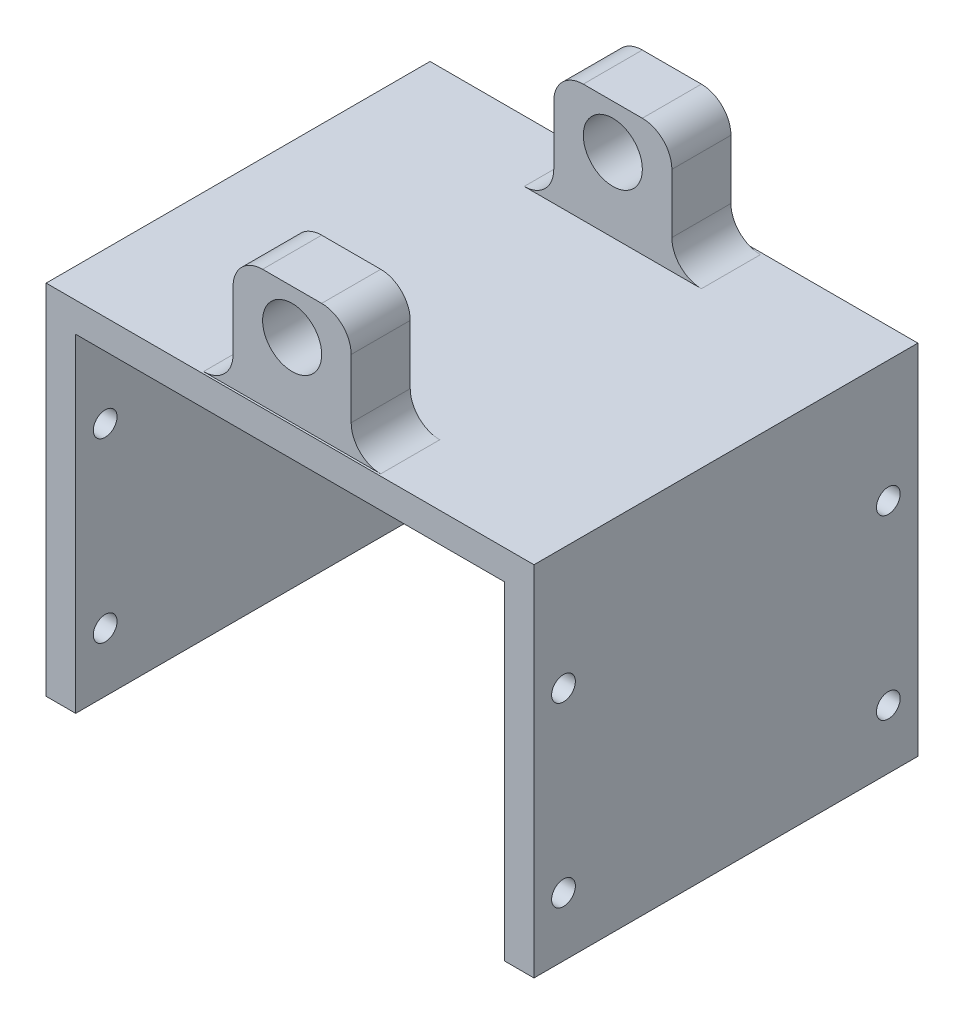
ISO-10303-21;
HEADER;
FILE_DESCRIPTION(('STEP AP214'),'2;1');
FILE_NAME('part.step','',(''),(''),'','','');
FILE_SCHEMA(('AUTOMOTIVE_DESIGN { 1 0 10303 214 1 1 1 1 }'));
ENDSEC;
DATA;
#1=APPLICATION_CONTEXT('core data for automotive mechanical design processes');
#2=APPLICATION_PROTOCOL_DEFINITION('international standard','automotive_design',2000,#1);
#3=PRODUCT_CONTEXT('',#1,'mechanical');
#4=PRODUCT('Part','Part','',(#3));
#5=PRODUCT_RELATED_PRODUCT_CATEGORY('part','',(#4));
#6=PRODUCT_DEFINITION_FORMATION('','',#4);
#7=PRODUCT_DEFINITION_CONTEXT('part definition',#1,'design');
#8=PRODUCT_DEFINITION('design','',#6,#7);
#9=PRODUCT_DEFINITION_SHAPE('','',#8);
#10=(LENGTH_UNIT() NAMED_UNIT(*) SI_UNIT(.MILLI.,.METRE.));
#11=(NAMED_UNIT(*) PLANE_ANGLE_UNIT() SI_UNIT($,.RADIAN.));
#12=(NAMED_UNIT(*) SI_UNIT($,.STERADIAN.) SOLID_ANGLE_UNIT());
#13=UNCERTAINTY_MEASURE_WITH_UNIT(LENGTH_MEASURE(1.E-05),#10,'distance_accuracy_value','');
#14=(GEOMETRIC_REPRESENTATION_CONTEXT(3) GLOBAL_UNCERTAINTY_ASSIGNED_CONTEXT((#13)) GLOBAL_UNIT_ASSIGNED_CONTEXT((#10,
#11,#12)) REPRESENTATION_CONTEXT('',''));
#15=CARTESIAN_POINT('',(0.,0.,0.));
#16=DIRECTION('',(0.,0.,1.));
#17=DIRECTION('',(1.,0.,0.));
#18=AXIS2_PLACEMENT_3D('',#15,#16,#17);
#19=CARTESIAN_POINT('',(65.151,0.,82.55));
#20=DIRECTION('',(1.,0.,0.));
#21=DIRECTION('',(0.,0.,-1.));
#22=AXIS2_PLACEMENT_3D('',#19,#20,#21);
#23=PLANE('',#22);
#24=DIRECTION('',(0.,0.,-1.));
#25=VECTOR('',#24,1.);
#26=CARTESIAN_POINT('',(65.151,96.012,82.55));
#27=LINE('',#26,#25);
#28=CARTESIAN_POINT('',(65.151,96.012,69.4055));
#29=VERTEX_POINT('',#28);
#30=CARTESIAN_POINT('',(65.151,96.012,82.1055));
#31=VERTEX_POINT('',#30);
#32=EDGE_CURVE('E342',#29,#31,#27,.F.);
#33=ORIENTED_EDGE('',*,*,#32,.T.);
#34=DIRECTION('',(0.,-1.,0.));
#35=VECTOR('',#34,1.);
#36=CARTESIAN_POINT('',(65.151,0.,82.1055));
#37=LINE('',#36,#35);
#38=CARTESIAN_POINT('',(65.151,83.312,82.1055));
#39=VERTEX_POINT('',#38);
#40=EDGE_CURVE('E206',#31,#39,#37,.T.);
#41=ORIENTED_EDGE('',*,*,#40,.T.);
#42=DIRECTION('',(0.,0.,-1.));
#43=VECTOR('',#42,1.);
#44=CARTESIAN_POINT('',(65.151,83.312,0.));
#45=LINE('',#44,#43);
#46=CARTESIAN_POINT('',(65.151,83.312,69.4055));
#47=VERTEX_POINT('',#46);
#48=EDGE_CURVE('E344',#39,#47,#45,.T.);
#49=ORIENTED_EDGE('',*,*,#48,.T.);
#50=DIRECTION('',(0.,1.,0.));
#51=VECTOR('',#50,1.);
#52=CARTESIAN_POINT('',(65.151,0.,69.4055));
#53=LINE('',#52,#51);
#54=EDGE_CURVE('E377',#47,#29,#53,.T.);
#55=ORIENTED_EDGE('',*,*,#54,.T.);
#56=EDGE_LOOP('',(#33,#41,#49,#55));
#57=FACE_BOUND('',#56,.T.);
#58=ADVANCED_FACE('F33',(#57),#23,.T.);
#59=CARTESIAN_POINT('',(0.,102.362,82.55));
#60=DIRECTION('',(0.,1.,0.));
#61=DIRECTION('',(-1.,0.,0.));
#62=AXIS2_PLACEMENT_3D('',#59,#60,#61);
#63=PLANE('',#62);
#64=DIRECTION('',(0.,0.,-1.));
#65=VECTOR('',#64,1.);
#66=CARTESIAN_POINT('',(46.101,102.362,82.55));
#67=LINE('',#66,#65);
#68=CARTESIAN_POINT('',(46.101,102.362,69.4055));
#69=VERTEX_POINT('',#68);
#70=CARTESIAN_POINT('',(46.101,102.362,82.1055));
#71=VERTEX_POINT('',#70);
#72=EDGE_CURVE('E236',#69,#71,#67,.F.);
#73=ORIENTED_EDGE('',*,*,#72,.T.);
#74=DIRECTION('',(1.,0.,0.));
#75=VECTOR('',#74,1.);
#76=CARTESIAN_POINT('',(0.,102.362,82.1055));
#77=LINE('',#76,#75);
#78=CARTESIAN_POINT('',(58.801,102.362,82.1055));
#79=VERTEX_POINT('',#78);
#80=EDGE_CURVE('E416',#71,#79,#77,.T.);
#81=ORIENTED_EDGE('',*,*,#80,.T.);
#82=DIRECTION('',(0.,0.,-1.));
#83=VECTOR('',#82,1.);
#84=CARTESIAN_POINT('',(58.801,102.362,82.55));
#85=LINE('',#84,#83);
#86=CARTESIAN_POINT('',(58.801,102.362,69.4055));
#87=VERTEX_POINT('',#86);
#88=EDGE_CURVE('E41',#79,#87,#85,.T.);
#89=ORIENTED_EDGE('',*,*,#88,.T.);
#90=DIRECTION('',(-1.,0.,0.));
#91=VECTOR('',#90,1.);
#92=CARTESIAN_POINT('',(0.,102.362,69.4055));
#93=LINE('',#92,#91);
#94=EDGE_CURVE('E383',#87,#69,#93,.T.);
#95=ORIENTED_EDGE('',*,*,#94,.T.);
#96=EDGE_LOOP('',(#73,#81,#89,#95));
#97=FACE_BOUND('',#96,.T.);
#98=ADVANCED_FACE('F521',(#97),#63,.T.);
#99=CARTESIAN_POINT('',(39.751,0.,82.55));
#100=DIRECTION('',(1.,0.,0.));
#101=DIRECTION('',(0.,1.,0.));
#102=AXIS2_PLACEMENT_3D('',#99,#100,#101);
#103=PLANE('',#102);
#104=DIRECTION('',(0.,-1.,0.));
#105=VECTOR('',#104,1.);
#106=CARTESIAN_POINT('',(39.751,0.,82.1055));
#107=LINE('',#106,#105);
#108=CARTESIAN_POINT('',(39.751,96.012,82.1055));
#109=VERTEX_POINT('',#108);
#110=CARTESIAN_POINT('',(39.751,83.312,82.1055));
#111=VERTEX_POINT('',#110);
#112=EDGE_CURVE('E201',#109,#111,#107,.T.);
#113=ORIENTED_EDGE('',*,*,#112,.F.);
#114=DIRECTION('',(0.,0.,-1.));
#115=VECTOR('',#114,1.);
#116=CARTESIAN_POINT('',(39.751,96.012,0.));
#117=LINE('',#116,#115);
#118=CARTESIAN_POINT('',(39.751,96.012,69.4055));
#119=VERTEX_POINT('',#118);
#120=EDGE_CURVE('E226',#109,#119,#117,.T.);
#121=ORIENTED_EDGE('',*,*,#120,.T.);
#122=DIRECTION('',(0.,1.,0.));
#123=VECTOR('',#122,1.);
#124=CARTESIAN_POINT('',(39.751,0.,69.4055));
#125=LINE('',#124,#123);
#126=CARTESIAN_POINT('',(39.751,83.312,69.4055));
#127=VERTEX_POINT('',#126);
#128=EDGE_CURVE('E385',#127,#119,#125,.T.);
#129=ORIENTED_EDGE('',*,*,#128,.F.);
#130=DIRECTION('',(0.,0.,-1.));
#131=VECTOR('',#130,1.);
#132=CARTESIAN_POINT('',(39.751,83.312,82.55));
#133=LINE('',#132,#131);
#134=EDGE_CURVE('E232',#127,#111,#133,.F.);
#135=ORIENTED_EDGE('',*,*,#134,.T.);
#136=EDGE_LOOP('',(#113,#121,#129,#135));
#137=FACE_BOUND('',#136,.T.);
#138=ADVANCED_FACE('F526',(#137),#103,.F.);
#139=CARTESIAN_POINT('',(52.451,92.837,82.55));
#140=DIRECTION('',(0.,0.,-1.));
#141=DIRECTION('',(-1.,0.,0.));
#142=AXIS2_PLACEMENT_3D('',#139,#140,#141);
#143=CYLINDRICAL_SURFACE('',#142,6.35);
#144=CARTESIAN_POINT('',(52.451,92.837,69.4055));
#145=DIRECTION('',(0.,0.,-1.));
#146=DIRECTION('',(-1.,0.,0.));
#147=AXIS2_PLACEMENT_3D('',#144,#145,#146);
#148=CIRCLE('',#147,6.35);
#149=CARTESIAN_POINT('',(46.101,92.837,69.4055));
#150=VERTEX_POINT('',#149);
#151=EDGE_CURVE('E370',#150,#150,#148,.T.);
#152=ORIENTED_EDGE('',*,*,#151,.T.);
#153=EDGE_LOOP('',(#152));
#154=FACE_BOUND('',#153,.T.);
#155=CARTESIAN_POINT('',(52.451,92.837,82.1055));
#156=DIRECTION('',(0.,0.,1.));
#157=DIRECTION('',(1.,0.,0.));
#158=AXIS2_PLACEMENT_3D('',#155,#156,#157);
#159=CIRCLE('',#158,6.35);
#160=CARTESIAN_POINT('',(58.801,92.837,82.1055));
#161=VERTEX_POINT('',#160);
#162=EDGE_CURVE('E408',#161,#161,#159,.T.);
#163=ORIENTED_EDGE('',*,*,#162,.T.);
#164=EDGE_LOOP('',(#163));
#165=FACE_BOUND('',#164,.T.);
#166=ADVANCED_FACE('F722',(#154,#165),#143,.F.);
#167=CARTESIAN_POINT('',(71.501,83.312,82.55));
#168=DIRECTION('',(0.,0.,1.));
#169=DIRECTION('',(1.,0.,0.));
#170=AXIS2_PLACEMENT_3D('',#167,#168,#169);
#171=CYLINDRICAL_SURFACE('',#170,6.35);
#172=CARTESIAN_POINT('',(71.501,83.312,82.1055));
#173=DIRECTION('',(0.,0.,1.));
#174=DIRECTION('',(1.,0.,0.));
#175=AXIS2_PLACEMENT_3D('',#172,#173,#174);
#176=CIRCLE('',#175,6.35);
#177=CARTESIAN_POINT('',(71.501,76.962,82.1055));
#178=VERTEX_POINT('',#177);
#179=EDGE_CURVE('E411',#178,#39,#176,.F.);
#180=ORIENTED_EDGE('',*,*,#179,.F.);
#181=DIRECTION('',(0.,0.,-1.));
#182=VECTOR('',#181,1.);
#183=CARTESIAN_POINT('',(71.501,76.962,82.55));
#184=LINE('',#183,#182);
#185=CARTESIAN_POINT('',(71.501,76.962,69.4055));
#186=VERTEX_POINT('',#185);
#187=EDGE_CURVE('E217',#186,#178,#184,.F.);
#188=ORIENTED_EDGE('',*,*,#187,.F.);
#189=CARTESIAN_POINT('',(71.501,83.312,69.4055));
#190=DIRECTION('',(0.,0.,-1.));
#191=DIRECTION('',(-1.,0.,0.));
#192=AXIS2_PLACEMENT_3D('',#189,#190,#191);
#193=CIRCLE('',#192,6.35);
#194=EDGE_CURVE('E373',#47,#186,#193,.F.);
#195=ORIENTED_EDGE('',*,*,#194,.F.);
#196=ORIENTED_EDGE('',*,*,#48,.F.);
#197=EDGE_LOOP('',(#180,#188,#195,#196));
#198=FACE_BOUND('',#197,.T.);
#199=ADVANCED_FACE('F731',(#198),#171,.F.);
#200=CARTESIAN_POINT('',(33.401,83.312,82.55));
#201=DIRECTION('',(0.,0.,-1.));
#202=DIRECTION('',(-1.,0.,0.));
#203=AXIS2_PLACEMENT_3D('',#200,#201,#202);
#204=CYLINDRICAL_SURFACE('',#203,6.35);
#205=CARTESIAN_POINT('',(33.401,83.312,82.1055));
#206=DIRECTION('',(0.,0.,1.));
#207=DIRECTION('',(1.,0.,0.));
#208=AXIS2_PLACEMENT_3D('',#205,#206,#207);
#209=CIRCLE('',#208,6.35);
#210=CARTESIAN_POINT('',(33.401,76.962,82.1055));
#211=VERTEX_POINT('',#210);
#212=EDGE_CURVE('E195',#111,#211,#209,.F.);
#213=ORIENTED_EDGE('',*,*,#212,.F.);
#214=ORIENTED_EDGE('',*,*,#134,.F.);
#215=CARTESIAN_POINT('',(33.401,83.312,69.4055));
#216=DIRECTION('',(0.,0.,-1.));
#217=DIRECTION('',(-1.,0.,0.));
#218=AXIS2_PLACEMENT_3D('',#215,#216,#217);
#219=CIRCLE('',#218,6.35);
#220=CARTESIAN_POINT('',(33.401,76.962,69.4055));
#221=VERTEX_POINT('',#220);
#222=EDGE_CURVE('E223',#221,#127,#219,.F.);
#223=ORIENTED_EDGE('',*,*,#222,.F.);
#224=DIRECTION('',(0.,0.,-1.));
#225=VECTOR('',#224,1.);
#226=CARTESIAN_POINT('',(33.401,76.962,82.55));
#227=LINE('',#226,#225);
#228=EDGE_CURVE('E214',#211,#221,#227,.T.);
#229=ORIENTED_EDGE('',*,*,#228,.F.);
#230=EDGE_LOOP('',(#213,#214,#223,#229));
#231=FACE_BOUND('',#230,.T.);
#232=ADVANCED_FACE('F222',(#231),#204,.F.);
#233=CARTESIAN_POINT('',(58.801,96.012,82.55));
#234=DIRECTION('',(0.,0.,-1.));
#235=DIRECTION('',(-1.,0.,0.));
#236=AXIS2_PLACEMENT_3D('',#233,#234,#235);
#237=CYLINDRICAL_SURFACE('',#236,6.35);
#238=ORIENTED_EDGE('',*,*,#88,.F.);
#239=CARTESIAN_POINT('',(58.801,96.012,82.1055));
#240=DIRECTION('',(0.,0.,1.));
#241=DIRECTION('',(1.,0.,0.));
#242=AXIS2_PLACEMENT_3D('',#239,#240,#241);
#243=CIRCLE('',#242,6.35);
#244=EDGE_CURVE('E207',#79,#31,#243,.F.);
#245=ORIENTED_EDGE('',*,*,#244,.T.);
#246=ORIENTED_EDGE('',*,*,#32,.F.);
#247=CARTESIAN_POINT('',(58.801,96.012,69.4055));
#248=DIRECTION('',(0.,0.,-1.));
#249=DIRECTION('',(-1.,0.,0.));
#250=AXIS2_PLACEMENT_3D('',#247,#248,#249);
#251=CIRCLE('',#250,6.35);
#252=EDGE_CURVE('E380',#29,#87,#251,.F.);
#253=ORIENTED_EDGE('',*,*,#252,.T.);
#254=EDGE_LOOP('',(#238,#245,#246,#253));
#255=FACE_BOUND('',#254,.T.);
#256=ADVANCED_FACE('F540',(#255),#237,.T.);
#257=CARTESIAN_POINT('',(46.101,96.012,82.55));
#258=DIRECTION('',(0.,0.,1.));
#259=DIRECTION('',(1.,0.,0.));
#260=AXIS2_PLACEMENT_3D('',#257,#258,#259);
#261=CYLINDRICAL_SURFACE('',#260,6.35);
#262=ORIENTED_EDGE('',*,*,#120,.F.);
#263=CARTESIAN_POINT('',(46.101,96.012,82.1055));
#264=DIRECTION('',(0.,0.,1.));
#265=DIRECTION('',(1.,0.,0.));
#266=AXIS2_PLACEMENT_3D('',#263,#264,#265);
#267=CIRCLE('',#266,6.35);
#268=EDGE_CURVE('E218',#109,#71,#267,.F.);
#269=ORIENTED_EDGE('',*,*,#268,.T.);
#270=ORIENTED_EDGE('',*,*,#72,.F.);
#271=CARTESIAN_POINT('',(46.101,96.012,69.4055));
#272=DIRECTION('',(0.,0.,-1.));
#273=DIRECTION('',(-1.,0.,0.));
#274=AXIS2_PLACEMENT_3D('',#271,#272,#273);
#275=CIRCLE('',#274,6.35);
#276=EDGE_CURVE('E388',#69,#119,#275,.F.);
#277=ORIENTED_EDGE('',*,*,#276,.T.);
#278=EDGE_LOOP('',(#262,#269,#270,#277));
#279=FACE_BOUND('',#278,.T.);
#280=ADVANCED_FACE('F35',(#279),#261,.T.);
#281=CARTESIAN_POINT('',(0.,0.,82.55));
#282=DIRECTION('',(0.,0.,1.));
#283=DIRECTION('',(1.,0.,0.));
#284=AXIS2_PLACEMENT_3D('',#281,#282,#283);
#285=PLANE('',#284);
#286=DIRECTION('',(0.,-1.,0.));
#287=VECTOR('',#286,1.);
#288=CARTESIAN_POINT('',(104.902,0.,82.55));
#289=LINE('',#288,#287);
#290=CARTESIAN_POINT('',(104.902,76.962,82.55));
#291=VERTEX_POINT('',#290);
#292=CARTESIAN_POINT('',(104.902,0.,82.55));
#293=VERTEX_POINT('',#292);
#294=EDGE_CURVE('E298',#291,#293,#289,.T.);
#295=ORIENTED_EDGE('',*,*,#294,.F.);
#296=DIRECTION('',(1.,0.,0.));
#297=VECTOR('',#296,1.);
#298=CARTESIAN_POINT('',(0.,76.962,82.55));
#299=LINE('',#298,#297);
#300=CARTESIAN_POINT('',(0.,76.962,82.55));
#301=VERTEX_POINT('',#300);
#302=EDGE_CURVE('E279',#301,#291,#299,.T.);
#303=ORIENTED_EDGE('',*,*,#302,.F.);
#304=DIRECTION('',(0.,-1.,0.));
#305=VECTOR('',#304,1.);
#306=CARTESIAN_POINT('',(0.,0.,82.55));
#307=LINE('',#306,#305);
#308=CARTESIAN_POINT('',(0.,0.,82.55));
#309=VERTEX_POINT('',#308);
#310=EDGE_CURVE('E281',#301,#309,#307,.T.);
#311=ORIENTED_EDGE('',*,*,#310,.T.);
#312=DIRECTION('',(1.,0.,0.));
#313=VECTOR('',#312,1.);
#314=CARTESIAN_POINT('',(0.,0.,82.55));
#315=LINE('',#314,#313);
#316=CARTESIAN_POINT('',(6.34999999999999,0.,82.55));
#317=VERTEX_POINT('',#316);
#318=EDGE_CURVE('E285',#309,#317,#315,.T.);
#319=ORIENTED_EDGE('',*,*,#318,.T.);
#320=DIRECTION('',(0.,-1.,0.));
#321=VECTOR('',#320,1.);
#322=CARTESIAN_POINT('',(6.34999999999999,0.,82.55));
#323=LINE('',#322,#321);
#324=CARTESIAN_POINT('',(6.34999999999999,70.612,82.55));
#325=VERTEX_POINT('',#324);
#326=EDGE_CURVE('E287',#325,#317,#323,.T.);
#327=ORIENTED_EDGE('',*,*,#326,.F.);
#328=DIRECTION('',(1.,0.,0.));
#329=VECTOR('',#328,1.);
#330=CARTESIAN_POINT('',(0.,70.612,82.55));
#331=LINE('',#330,#329);
#332=CARTESIAN_POINT('',(98.552,70.612,82.55));
#333=VERTEX_POINT('',#332);
#334=EDGE_CURVE('E290',#325,#333,#331,.T.);
#335=ORIENTED_EDGE('',*,*,#334,.T.);
#336=DIRECTION('',(0.,-1.,0.));
#337=VECTOR('',#336,1.);
#338=CARTESIAN_POINT('',(98.552,0.,82.55));
#339=LINE('',#338,#337);
#340=CARTESIAN_POINT('',(98.552,0.,82.55));
#341=VERTEX_POINT('',#340);
#342=EDGE_CURVE('E293',#333,#341,#339,.T.);
#343=ORIENTED_EDGE('',*,*,#342,.T.);
#344=DIRECTION('',(1.,0.,0.));
#345=VECTOR('',#344,1.);
#346=CARTESIAN_POINT('',(0.,0.,82.55));
#347=LINE('',#346,#345);
#348=EDGE_CURVE('E296',#341,#293,#347,.T.);
#349=ORIENTED_EDGE('',*,*,#348,.T.);
#350=EDGE_LOOP('',(#295,#303,#311,#319,#327,#335,#343,#349));
#351=FACE_BOUND('',#350,.T.);
#352=ADVANCED_FACE('F495',(#351),#285,.T.);
#353=CARTESIAN_POINT('',(65.151,96.012,0.4445));
#354=VERTEX_POINT('',#353);
#355=CARTESIAN_POINT('',(65.151,96.012,13.1445));
#356=VERTEX_POINT('',#355);
#357=EDGE_CURVE('E265',#354,#356,#27,.F.);
#358=ORIENTED_EDGE('',*,*,#357,.T.);
#359=DIRECTION('',(0.,-1.,0.));
#360=VECTOR('',#359,1.);
#361=CARTESIAN_POINT('',(65.151,0.,13.1445));
#362=LINE('',#361,#360);
#363=CARTESIAN_POINT('',(65.151,83.312,13.1445));
#364=VERTEX_POINT('',#363);
#365=EDGE_CURVE('E354',#356,#364,#362,.T.);
#366=ORIENTED_EDGE('',*,*,#365,.T.);
#367=CARTESIAN_POINT('',(65.151,83.312,0.4445));
#368=VERTEX_POINT('',#367);
#369=EDGE_CURVE('E343',#364,#368,#45,.T.);
#370=ORIENTED_EDGE('',*,*,#369,.T.);
#371=DIRECTION('',(0.,1.,0.));
#372=VECTOR('',#371,1.);
#373=CARTESIAN_POINT('',(65.151,0.,0.4445));
#374=LINE('',#373,#372);
#375=EDGE_CURVE('E268',#368,#354,#374,.T.);
#376=ORIENTED_EDGE('',*,*,#375,.T.);
#377=EDGE_LOOP('',(#358,#366,#370,#376));
#378=FACE_BOUND('',#377,.T.);
#379=ADVANCED_FACE('F353',(#378),#23,.T.);
#380=CARTESIAN_POINT('',(46.101,102.362,0.4445));
#381=VERTEX_POINT('',#380);
#382=CARTESIAN_POINT('',(46.101,102.362,13.1445));
#383=VERTEX_POINT('',#382);
#384=EDGE_CURVE('E237',#381,#383,#67,.F.);
#385=ORIENTED_EDGE('',*,*,#384,.T.);
#386=DIRECTION('',(1.,0.,0.));
#387=VECTOR('',#386,1.);
#388=CARTESIAN_POINT('',(0.,102.362,13.1445));
#389=LINE('',#388,#387);
#390=CARTESIAN_POINT('',(58.801,102.362,13.1445));
#391=VERTEX_POINT('',#390);
#392=EDGE_CURVE('E48',#383,#391,#389,.T.);
#393=ORIENTED_EDGE('',*,*,#392,.T.);
#394=CARTESIAN_POINT('',(58.801,102.362,0.4445));
#395=VERTEX_POINT('',#394);
#396=EDGE_CURVE('E239',#391,#395,#85,.T.);
#397=ORIENTED_EDGE('',*,*,#396,.T.);
#398=DIRECTION('',(-1.,0.,0.));
#399=VECTOR('',#398,1.);
#400=CARTESIAN_POINT('',(0.,102.362,0.4445));
#401=LINE('',#400,#399);
#402=EDGE_CURVE('E250',#395,#381,#401,.T.);
#403=ORIENTED_EDGE('',*,*,#402,.T.);
#404=EDGE_LOOP('',(#385,#393,#397,#403));
#405=FACE_BOUND('',#404,.T.);
#406=ADVANCED_FACE('F249',(#405),#63,.T.);
#407=DIRECTION('',(0.,-1.,0.));
#408=VECTOR('',#407,1.);
#409=CARTESIAN_POINT('',(39.751,0.,13.1445));
#410=LINE('',#409,#408);
#411=CARTESIAN_POINT('',(39.751,96.012,13.1445));
#412=VERTEX_POINT('',#411);
#413=CARTESIAN_POINT('',(39.751,83.312,13.1445));
#414=VERTEX_POINT('',#413);
#415=EDGE_CURVE('E401',#412,#414,#410,.T.);
#416=ORIENTED_EDGE('',*,*,#415,.F.);
#417=CARTESIAN_POINT('',(39.751,96.012,0.4445));
#418=VERTEX_POINT('',#417);
#419=EDGE_CURVE('E56',#412,#418,#117,.T.);
#420=ORIENTED_EDGE('',*,*,#419,.T.);
#421=DIRECTION('',(0.,1.,0.));
#422=VECTOR('',#421,1.);
#423=CARTESIAN_POINT('',(39.751,0.,0.4445));
#424=LINE('',#423,#422);
#425=CARTESIAN_POINT('',(39.751,83.312,0.4445));
#426=VERTEX_POINT('',#425);
#427=EDGE_CURVE('E260',#426,#418,#424,.T.);
#428=ORIENTED_EDGE('',*,*,#427,.F.);
#429=EDGE_CURVE('E233',#426,#414,#133,.F.);
#430=ORIENTED_EDGE('',*,*,#429,.T.);
#431=EDGE_LOOP('',(#416,#420,#428,#430));
#432=FACE_BOUND('',#431,.T.);
#433=ADVANCED_FACE('F535',(#432),#103,.F.);
#434=CARTESIAN_POINT('',(52.451,92.837,0.4445));
#435=DIRECTION('',(0.,0.,-1.));
#436=DIRECTION('',(-1.,0.,0.));
#437=AXIS2_PLACEMENT_3D('',#434,#435,#436);
#438=CIRCLE('',#437,6.35);
#439=CARTESIAN_POINT('',(46.101,92.837,0.4445));
#440=VERTEX_POINT('',#439);
#441=EDGE_CURVE('E275',#440,#440,#438,.T.);
#442=ORIENTED_EDGE('',*,*,#441,.T.);
#443=EDGE_LOOP('',(#442));
#444=FACE_BOUND('',#443,.T.);
#445=CARTESIAN_POINT('',(52.451,92.837,13.1445));
#446=DIRECTION('',(0.,0.,1.));
#447=DIRECTION('',(1.,0.,0.));
#448=AXIS2_PLACEMENT_3D('',#445,#446,#447);
#449=CIRCLE('',#448,6.35);
#450=CARTESIAN_POINT('',(58.801,92.837,13.1445));
#451=VERTEX_POINT('',#450);
#452=EDGE_CURVE('E391',#451,#451,#449,.T.);
#453=ORIENTED_EDGE('',*,*,#452,.T.);
#454=EDGE_LOOP('',(#453));
#455=FACE_BOUND('',#454,.T.);
#456=ADVANCED_FACE('F733',(#444,#455),#143,.F.);
#457=CARTESIAN_POINT('',(71.501,83.312,13.1445));
#458=DIRECTION('',(0.,0.,1.));
#459=DIRECTION('',(1.,0.,0.));
#460=AXIS2_PLACEMENT_3D('',#457,#458,#459);
#461=CIRCLE('',#460,6.35);
#462=CARTESIAN_POINT('',(71.501,76.962,13.1445));
#463=VERTEX_POINT('',#462);
#464=EDGE_CURVE('E363',#463,#364,#461,.F.);
#465=ORIENTED_EDGE('',*,*,#464,.F.);
#466=CARTESIAN_POINT('',(71.501,76.962,0.4445));
#467=VERTEX_POINT('',#466);
#468=EDGE_CURVE('E228',#467,#463,#184,.F.);
#469=ORIENTED_EDGE('',*,*,#468,.F.);
#470=CARTESIAN_POINT('',(71.501,83.312,0.4445));
#471=DIRECTION('',(0.,0.,-1.));
#472=DIRECTION('',(-1.,0.,0.));
#473=AXIS2_PLACEMENT_3D('',#470,#471,#472);
#474=CIRCLE('',#473,6.35);
#475=EDGE_CURVE('E273',#368,#467,#474,.F.);
#476=ORIENTED_EDGE('',*,*,#475,.F.);
#477=ORIENTED_EDGE('',*,*,#369,.F.);
#478=EDGE_LOOP('',(#465,#469,#476,#477));
#479=FACE_BOUND('',#478,.T.);
#480=ADVANCED_FACE('F361',(#479),#171,.F.);
#481=CARTESIAN_POINT('',(33.401,83.312,13.1445));
#482=DIRECTION('',(0.,0.,1.));
#483=DIRECTION('',(1.,0.,0.));
#484=AXIS2_PLACEMENT_3D('',#481,#482,#483);
#485=CIRCLE('',#484,6.35);
#486=CARTESIAN_POINT('',(33.401,76.962,13.1445));
#487=VERTEX_POINT('',#486);
#488=EDGE_CURVE('E396',#414,#487,#485,.F.);
#489=ORIENTED_EDGE('',*,*,#488,.F.);
#490=ORIENTED_EDGE('',*,*,#429,.F.);
#491=CARTESIAN_POINT('',(33.401,83.312,0.4445));
#492=DIRECTION('',(0.,0.,-1.));
#493=DIRECTION('',(-1.,0.,0.));
#494=AXIS2_PLACEMENT_3D('',#491,#492,#493);
#495=CIRCLE('',#494,6.35);
#496=CARTESIAN_POINT('',(33.401,76.962,0.4445));
#497=VERTEX_POINT('',#496);
#498=EDGE_CURVE('E266',#497,#426,#495,.F.);
#499=ORIENTED_EDGE('',*,*,#498,.F.);
#500=EDGE_CURVE('E224',#487,#497,#227,.T.);
#501=ORIENTED_EDGE('',*,*,#500,.F.);
#502=EDGE_LOOP('',(#489,#490,#499,#501));
#503=FACE_BOUND('',#502,.T.);
#504=ADVANCED_FACE('F749',(#503),#204,.F.);
#505=ORIENTED_EDGE('',*,*,#396,.F.);
#506=CARTESIAN_POINT('',(58.801,96.012,13.1445));
#507=DIRECTION('',(0.,0.,1.));
#508=DIRECTION('',(1.,0.,0.));
#509=AXIS2_PLACEMENT_3D('',#506,#507,#508);
#510=CIRCLE('',#509,6.35);
#511=EDGE_CURVE('E398',#391,#356,#510,.F.);
#512=ORIENTED_EDGE('',*,*,#511,.T.);
#513=ORIENTED_EDGE('',*,*,#357,.F.);
#514=CARTESIAN_POINT('',(58.801,96.012,0.4445));
#515=DIRECTION('',(0.,0.,-1.));
#516=DIRECTION('',(-1.,0.,0.));
#517=AXIS2_PLACEMENT_3D('',#514,#515,#516);
#518=CIRCLE('',#517,6.35);
#519=EDGE_CURVE('E258',#354,#395,#518,.F.);
#520=ORIENTED_EDGE('',*,*,#519,.T.);
#521=EDGE_LOOP('',(#505,#512,#513,#520));
#522=FACE_BOUND('',#521,.T.);
#523=ADVANCED_FACE('F263',(#522),#237,.T.);
#524=ORIENTED_EDGE('',*,*,#419,.F.);
#525=CARTESIAN_POINT('',(46.101,96.012,13.1445));
#526=DIRECTION('',(0.,0.,1.));
#527=DIRECTION('',(1.,0.,0.));
#528=AXIS2_PLACEMENT_3D('',#525,#526,#527);
#529=CIRCLE('',#528,6.35);
#530=EDGE_CURVE('E403',#412,#383,#529,.F.);
#531=ORIENTED_EDGE('',*,*,#530,.T.);
#532=ORIENTED_EDGE('',*,*,#384,.F.);
#533=CARTESIAN_POINT('',(46.101,96.012,0.4445));
#534=DIRECTION('',(0.,0.,-1.));
#535=DIRECTION('',(-1.,0.,0.));
#536=AXIS2_PLACEMENT_3D('',#533,#534,#535);
#537=CIRCLE('',#536,6.35);
#538=EDGE_CURVE('E11',#381,#418,#537,.F.);
#539=ORIENTED_EDGE('',*,*,#538,.T.);
#540=EDGE_LOOP('',(#524,#531,#532,#539));
#541=FACE_BOUND('',#540,.T.);
#542=ADVANCED_FACE('F542',(#541),#261,.T.);
#543=CARTESIAN_POINT('',(0.,0.,0.));
#544=DIRECTION('',(0.,0.,1.));
#545=DIRECTION('',(1.,0.,0.));
#546=AXIS2_PLACEMENT_3D('',#543,#544,#545);
#547=PLANE('',#546);
#548=DIRECTION('',(1.,0.,0.));
#549=VECTOR('',#548,1.);
#550=CARTESIAN_POINT('',(0.,76.962,0.));
#551=LINE('',#550,#549);
#552=CARTESIAN_POINT('',(0.,76.962,0.));
#553=VERTEX_POINT('',#552);
#554=CARTESIAN_POINT('',(104.902,76.962,0.));
#555=VERTEX_POINT('',#554);
#556=EDGE_CURVE('E278',#553,#555,#551,.T.);
#557=ORIENTED_EDGE('',*,*,#556,.T.);
#558=DIRECTION('',(0.,-1.,0.));
#559=VECTOR('',#558,1.);
#560=CARTESIAN_POINT('',(104.902,0.,0.));
#561=LINE('',#560,#559);
#562=CARTESIAN_POINT('',(104.902,0.,0.));
#563=VERTEX_POINT('',#562);
#564=EDGE_CURVE('E282',#555,#563,#561,.T.);
#565=ORIENTED_EDGE('',*,*,#564,.T.);
#566=DIRECTION('',(1.,0.,0.));
#567=VECTOR('',#566,1.);
#568=CARTESIAN_POINT('',(0.,0.,0.));
#569=LINE('',#568,#567);
#570=CARTESIAN_POINT('',(98.552,0.,0.));
#571=VERTEX_POINT('',#570);
#572=EDGE_CURVE('E319',#571,#563,#569,.T.);
#573=ORIENTED_EDGE('',*,*,#572,.F.);
#574=DIRECTION('',(0.,-1.,0.));
#575=VECTOR('',#574,1.);
#576=CARTESIAN_POINT('',(98.552,0.,0.));
#577=LINE('',#576,#575);
#578=CARTESIAN_POINT('',(98.552,70.612,0.));
#579=VERTEX_POINT('',#578);
#580=EDGE_CURVE('E316',#579,#571,#577,.T.);
#581=ORIENTED_EDGE('',*,*,#580,.F.);
#582=DIRECTION('',(1.,0.,0.));
#583=VECTOR('',#582,1.);
#584=CARTESIAN_POINT('',(0.,70.612,0.));
#585=LINE('',#584,#583);
#586=CARTESIAN_POINT('',(6.34999999999999,70.612,0.));
#587=VERTEX_POINT('',#586);
#588=EDGE_CURVE('E313',#587,#579,#585,.T.);
#589=ORIENTED_EDGE('',*,*,#588,.F.);
#590=DIRECTION('',(0.,-1.,0.));
#591=VECTOR('',#590,1.);
#592=CARTESIAN_POINT('',(6.34999999999999,0.,0.));
#593=LINE('',#592,#591);
#594=CARTESIAN_POINT('',(6.34999999999999,0.,0.));
#595=VERTEX_POINT('',#594);
#596=EDGE_CURVE('E310',#587,#595,#593,.T.);
#597=ORIENTED_EDGE('',*,*,#596,.T.);
#598=DIRECTION('',(1.,0.,0.));
#599=VECTOR('',#598,1.);
#600=CARTESIAN_POINT('',(0.,0.,0.));
#601=LINE('',#600,#599);
#602=CARTESIAN_POINT('',(0.,0.,0.));
#603=VERTEX_POINT('',#602);
#604=EDGE_CURVE('E307',#603,#595,#601,.T.);
#605=ORIENTED_EDGE('',*,*,#604,.F.);
#606=DIRECTION('',(0.,-1.,0.));
#607=VECTOR('',#606,1.);
#608=CARTESIAN_POINT('',(0.,0.,0.));
#609=LINE('',#608,#607);
#610=EDGE_CURVE('E304',#553,#603,#609,.T.);
#611=ORIENTED_EDGE('',*,*,#610,.F.);
#612=EDGE_LOOP('',(#557,#565,#573,#581,#589,#597,#605,#611));
#613=FACE_BOUND('',#612,.T.);
#614=ADVANCED_FACE('F475',(#613),#547,.F.);
#615=CARTESIAN_POINT('',(0.,0.,82.55));
#616=DIRECTION('',(1.,0.,0.));
#617=DIRECTION('',(0.,0.,-1.));
#618=AXIS2_PLACEMENT_3D('',#615,#616,#617);
#619=PLANE('',#618);
#620=CARTESIAN_POINT('',(0.,50.8,6.35));
#621=DIRECTION('',(-1.,0.,0.));
#622=DIRECTION('',(0.,0.,1.));
#623=AXIS2_PLACEMENT_3D('',#620,#621,#622);
#624=CIRCLE('',#623,2.5527);
#625=CARTESIAN_POINT('',(0.,50.8,8.9027));
#626=VERTEX_POINT('',#625);
#627=EDGE_CURVE('E465',#626,#626,#624,.T.);
#628=ORIENTED_EDGE('',*,*,#627,.F.);
#629=EDGE_LOOP('',(#628));
#630=FACE_BOUND('',#629,.T.);
#631=CARTESIAN_POINT('',(0.,12.7,6.34999999999999));
#632=DIRECTION('',(-1.,0.,0.));
#633=DIRECTION('',(0.,0.,1.));
#634=AXIS2_PLACEMENT_3D('',#631,#632,#633);
#635=CIRCLE('',#634,2.5527);
#636=CARTESIAN_POINT('',(0.,12.7,8.90269999999999));
#637=VERTEX_POINT('',#636);
#638=EDGE_CURVE('E453',#637,#637,#635,.T.);
#639=ORIENTED_EDGE('',*,*,#638,.F.);
#640=EDGE_LOOP('',(#639));
#641=FACE_BOUND('',#640,.T.);
#642=CARTESIAN_POINT('',(0.,12.7,76.2));
#643=DIRECTION('',(-1.,0.,0.));
#644=DIRECTION('',(0.,0.,1.));
#645=AXIS2_PLACEMENT_3D('',#642,#643,#644);
#646=CIRCLE('',#645,2.5527);
#647=CARTESIAN_POINT('',(0.,12.7,78.7527));
#648=VERTEX_POINT('',#647);
#649=EDGE_CURVE('E441',#648,#648,#646,.T.);
#650=ORIENTED_EDGE('',*,*,#649,.F.);
#651=EDGE_LOOP('',(#650));
#652=FACE_BOUND('',#651,.T.);
#653=CARTESIAN_POINT('',(0.,50.8,76.2));
#654=DIRECTION('',(-1.,0.,0.));
#655=DIRECTION('',(0.,0.,1.));
#656=AXIS2_PLACEMENT_3D('',#653,#654,#655);
#657=CIRCLE('',#656,2.5527);
#658=CARTESIAN_POINT('',(0.,50.8,78.7527));
#659=VERTEX_POINT('',#658);
#660=EDGE_CURVE('E429',#659,#659,#657,.T.);
#661=ORIENTED_EDGE('',*,*,#660,.F.);
#662=EDGE_LOOP('',(#661));
#663=FACE_BOUND('',#662,.T.);
#664=ORIENTED_EDGE('',*,*,#610,.T.);
#665=DIRECTION('',(0.,0.,-1.));
#666=VECTOR('',#665,1.);
#667=CARTESIAN_POINT('',(0.,0.,82.55));
#668=LINE('',#667,#666);
#669=EDGE_CURVE('E337',#309,#603,#668,.T.);
#670=ORIENTED_EDGE('',*,*,#669,.F.);
#671=ORIENTED_EDGE('',*,*,#310,.F.);
#672=DIRECTION('',(0.,0.,-1.));
#673=VECTOR('',#672,1.);
#674=CARTESIAN_POINT('',(0.,76.962,82.55));
#675=LINE('',#674,#673);
#676=EDGE_CURVE('E340',#301,#553,#675,.T.);
#677=ORIENTED_EDGE('',*,*,#676,.T.);
#678=EDGE_LOOP('',(#664,#670,#671,#677));
#679=FACE_BOUND('',#678,.T.);
#680=ADVANCED_FACE('F471',(#630,#641,#652,#663,#679),#619,.F.);
#681=CARTESIAN_POINT('',(0.,0.,82.55));
#682=DIRECTION('',(0.,1.,0.));
#683=DIRECTION('',(0.,0.,1.));
#684=AXIS2_PLACEMENT_3D('',#681,#682,#683);
#685=PLANE('',#684);
#686=ORIENTED_EDGE('',*,*,#604,.T.);
#687=DIRECTION('',(0.,0.,-1.));
#688=VECTOR('',#687,1.);
#689=CARTESIAN_POINT('',(6.34999999999999,0.,82.55));
#690=LINE('',#689,#688);
#691=EDGE_CURVE('E335',#317,#595,#690,.T.);
#692=ORIENTED_EDGE('',*,*,#691,.F.);
#693=ORIENTED_EDGE('',*,*,#318,.F.);
#694=ORIENTED_EDGE('',*,*,#669,.T.);
#695=EDGE_LOOP('',(#686,#692,#693,#694));
#696=FACE_BOUND('',#695,.T.);
#697=ADVANCED_FACE('F474',(#696),#685,.F.);
#698=CARTESIAN_POINT('',(6.34999999999999,0.,82.55));
#699=DIRECTION('',(1.,0.,0.));
#700=DIRECTION('',(0.,0.,-1.));
#701=AXIS2_PLACEMENT_3D('',#698,#699,#700);
#702=PLANE('',#701);
#703=CARTESIAN_POINT('',(6.34999999999999,50.8,6.35));
#704=DIRECTION('',(1.,0.,0.));
#705=DIRECTION('',(0.,0.,-1.));
#706=AXIS2_PLACEMENT_3D('',#703,#704,#705);
#707=CIRCLE('',#706,2.55269999999999);
#708=CARTESIAN_POINT('',(6.34999999999999,50.8,3.79730000000001));
#709=VERTEX_POINT('',#708);
#710=EDGE_CURVE('E459',#709,#709,#707,.T.);
#711=ORIENTED_EDGE('',*,*,#710,.F.);
#712=EDGE_LOOP('',(#711));
#713=FACE_BOUND('',#712,.T.);
#714=CARTESIAN_POINT('',(6.34999999999999,12.7,6.34999999999999));
#715=DIRECTION('',(1.,0.,0.));
#716=DIRECTION('',(0.,0.,-1.));
#717=AXIS2_PLACEMENT_3D('',#714,#715,#716);
#718=CIRCLE('',#717,2.55269999999999);
#719=CARTESIAN_POINT('',(6.34999999999999,12.7,3.7973));
#720=VERTEX_POINT('',#719);
#721=EDGE_CURVE('E447',#720,#720,#718,.T.);
#722=ORIENTED_EDGE('',*,*,#721,.F.);
#723=EDGE_LOOP('',(#722));
#724=FACE_BOUND('',#723,.T.);
#725=CARTESIAN_POINT('',(6.34999999999999,12.7,76.2));
#726=DIRECTION('',(1.,0.,0.));
#727=DIRECTION('',(0.,0.,-1.));
#728=AXIS2_PLACEMENT_3D('',#725,#726,#727);
#729=CIRCLE('',#728,2.55269999999999);
#730=CARTESIAN_POINT('',(6.34999999999999,12.7,73.6473));
#731=VERTEX_POINT('',#730);
#732=EDGE_CURVE('E435',#731,#731,#729,.T.);
#733=ORIENTED_EDGE('',*,*,#732,.F.);
#734=EDGE_LOOP('',(#733));
#735=FACE_BOUND('',#734,.T.);
#736=CARTESIAN_POINT('',(6.34999999999999,50.8,76.2));
#737=DIRECTION('',(1.,0.,0.));
#738=DIRECTION('',(0.,0.,-1.));
#739=AXIS2_PLACEMENT_3D('',#736,#737,#738);
#740=CIRCLE('',#739,2.55269999999999);
#741=CARTESIAN_POINT('',(6.34999999999999,50.8,73.6473));
#742=VERTEX_POINT('',#741);
#743=EDGE_CURVE('E423',#742,#742,#740,.T.);
#744=ORIENTED_EDGE('',*,*,#743,.F.);
#745=EDGE_LOOP('',(#744));
#746=FACE_BOUND('',#745,.T.);
#747=ORIENTED_EDGE('',*,*,#596,.F.);
#748=DIRECTION('',(0.,0.,-1.));
#749=VECTOR('',#748,1.);
#750=CARTESIAN_POINT('',(6.34999999999999,70.612,82.55));
#751=LINE('',#750,#749);
#752=EDGE_CURVE('E333',#325,#587,#751,.T.);
#753=ORIENTED_EDGE('',*,*,#752,.F.);
#754=ORIENTED_EDGE('',*,*,#326,.T.);
#755=ORIENTED_EDGE('',*,*,#691,.T.);
#756=EDGE_LOOP('',(#747,#753,#754,#755));
#757=FACE_BOUND('',#756,.T.);
#758=ADVANCED_FACE('F510',(#713,#724,#735,#746,#757),#702,.T.);
#759=CARTESIAN_POINT('',(0.,70.612,82.55));
#760=DIRECTION('',(0.,1.,0.));
#761=DIRECTION('',(0.,0.,1.));
#762=AXIS2_PLACEMENT_3D('',#759,#760,#761);
#763=PLANE('',#762);
#764=ORIENTED_EDGE('',*,*,#588,.T.);
#765=DIRECTION('',(0.,0.,-1.));
#766=VECTOR('',#765,1.);
#767=CARTESIAN_POINT('',(98.552,70.612,82.55));
#768=LINE('',#767,#766);
#769=EDGE_CURVE('E330',#333,#579,#768,.T.);
#770=ORIENTED_EDGE('',*,*,#769,.F.);
#771=ORIENTED_EDGE('',*,*,#334,.F.);
#772=ORIENTED_EDGE('',*,*,#752,.T.);
#773=EDGE_LOOP('',(#764,#770,#771,#772));
#774=FACE_BOUND('',#773,.T.);
#775=ADVANCED_FACE('F507',(#774),#763,.F.);
#776=CARTESIAN_POINT('',(98.552,0.,82.55));
#777=DIRECTION('',(1.,0.,0.));
#778=DIRECTION('',(0.,1.,0.));
#779=AXIS2_PLACEMENT_3D('',#776,#777,#778);
#780=PLANE('',#779);
#781=CARTESIAN_POINT('',(98.552,50.8,6.35));
#782=DIRECTION('',(1.,0.,0.));
#783=DIRECTION('',(0.,1.,0.));
#784=AXIS2_PLACEMENT_3D('',#781,#782,#783);
#785=CIRCLE('',#784,2.55269999999999);
#786=CARTESIAN_POINT('',(98.552,53.3527,6.35));
#787=VERTEX_POINT('',#786);
#788=EDGE_CURVE('E456',#787,#787,#785,.T.);
#789=ORIENTED_EDGE('',*,*,#788,.T.);
#790=EDGE_LOOP('',(#789));
#791=FACE_BOUND('',#790,.T.);
#792=CARTESIAN_POINT('',(98.552,12.7,6.34999999999999));
#793=DIRECTION('',(1.,0.,0.));
#794=DIRECTION('',(0.,1.,0.));
#795=AXIS2_PLACEMENT_3D('',#792,#793,#794);
#796=CIRCLE('',#795,2.55269999999999);
#797=CARTESIAN_POINT('',(98.552,15.2527,6.34999999999999));
#798=VERTEX_POINT('',#797);
#799=EDGE_CURVE('E444',#798,#798,#796,.T.);
#800=ORIENTED_EDGE('',*,*,#799,.T.);
#801=EDGE_LOOP('',(#800));
#802=FACE_BOUND('',#801,.T.);
#803=CARTESIAN_POINT('',(98.552,12.7,76.2));
#804=DIRECTION('',(1.,0.,0.));
#805=DIRECTION('',(0.,1.,0.));
#806=AXIS2_PLACEMENT_3D('',#803,#804,#805);
#807=CIRCLE('',#806,2.55269999999999);
#808=CARTESIAN_POINT('',(98.552,15.2527,76.2));
#809=VERTEX_POINT('',#808);
#810=EDGE_CURVE('E432',#809,#809,#807,.T.);
#811=ORIENTED_EDGE('',*,*,#810,.T.);
#812=EDGE_LOOP('',(#811));
#813=FACE_BOUND('',#812,.T.);
#814=CARTESIAN_POINT('',(98.552,50.8,76.2));
#815=DIRECTION('',(1.,0.,0.));
#816=DIRECTION('',(0.,1.,0.));
#817=AXIS2_PLACEMENT_3D('',#814,#815,#816);
#818=CIRCLE('',#817,2.55269999999999);
#819=CARTESIAN_POINT('',(98.552,53.3527,76.2));
#820=VERTEX_POINT('',#819);
#821=EDGE_CURVE('E219',#820,#820,#818,.T.);
#822=ORIENTED_EDGE('',*,*,#821,.T.);
#823=EDGE_LOOP('',(#822));
#824=FACE_BOUND('',#823,.T.);
#825=ORIENTED_EDGE('',*,*,#580,.T.);
#826=DIRECTION('',(0.,0.,-1.));
#827=VECTOR('',#826,1.);
#828=CARTESIAN_POINT('',(98.552,0.,82.55));
#829=LINE('',#828,#827);
#830=EDGE_CURVE('E327',#341,#571,#829,.T.);
#831=ORIENTED_EDGE('',*,*,#830,.F.);
#832=ORIENTED_EDGE('',*,*,#342,.F.);
#833=ORIENTED_EDGE('',*,*,#769,.T.);
#834=EDGE_LOOP('',(#825,#831,#832,#833));
#835=FACE_BOUND('',#834,.T.);
#836=ADVANCED_FACE('F504',(#791,#802,#813,#824,#835),#780,.F.);
#837=CARTESIAN_POINT('',(0.,0.,82.55));
#838=DIRECTION('',(0.,1.,0.));
#839=DIRECTION('',(0.,0.,1.));
#840=AXIS2_PLACEMENT_3D('',#837,#838,#839);
#841=PLANE('',#840);
#842=ORIENTED_EDGE('',*,*,#572,.T.);
#843=DIRECTION('',(0.,0.,-1.));
#844=VECTOR('',#843,1.);
#845=CARTESIAN_POINT('',(104.902,0.,82.55));
#846=LINE('',#845,#844);
#847=EDGE_CURVE('E325',#293,#563,#846,.T.);
#848=ORIENTED_EDGE('',*,*,#847,.F.);
#849=ORIENTED_EDGE('',*,*,#348,.F.);
#850=ORIENTED_EDGE('',*,*,#830,.T.);
#851=EDGE_LOOP('',(#842,#848,#849,#850));
#852=FACE_BOUND('',#851,.T.);
#853=ADVANCED_FACE('F499',(#852),#841,.F.);
#854=CARTESIAN_POINT('',(104.902,0.,82.55));
#855=DIRECTION('',(1.,0.,0.));
#856=DIRECTION('',(0.,0.,-1.));
#857=AXIS2_PLACEMENT_3D('',#854,#855,#856);
#858=PLANE('',#857);
#859=CARTESIAN_POINT('',(104.902,50.8,6.35));
#860=DIRECTION('',(-1.,0.,0.));
#861=DIRECTION('',(0.,0.,1.));
#862=AXIS2_PLACEMENT_3D('',#859,#860,#861);
#863=CIRCLE('',#862,2.55269999999998);
#864=CARTESIAN_POINT('',(104.902,50.8,8.90269999999998));
#865=VERTEX_POINT('',#864);
#866=EDGE_CURVE('E462',#865,#865,#863,.T.);
#867=ORIENTED_EDGE('',*,*,#866,.T.);
#868=EDGE_LOOP('',(#867));
#869=FACE_BOUND('',#868,.T.);
#870=CARTESIAN_POINT('',(104.902,12.7,6.34999999999999));
#871=DIRECTION('',(-1.,0.,0.));
#872=DIRECTION('',(0.,0.,1.));
#873=AXIS2_PLACEMENT_3D('',#870,#871,#872);
#874=CIRCLE('',#873,2.55269999999998);
#875=CARTESIAN_POINT('',(104.902,12.7,8.90269999999998));
#876=VERTEX_POINT('',#875);
#877=EDGE_CURVE('E450',#876,#876,#874,.T.);
#878=ORIENTED_EDGE('',*,*,#877,.T.);
#879=EDGE_LOOP('',(#878));
#880=FACE_BOUND('',#879,.T.);
#881=CARTESIAN_POINT('',(104.902,12.7,76.2));
#882=DIRECTION('',(-1.,0.,0.));
#883=DIRECTION('',(0.,0.,1.));
#884=AXIS2_PLACEMENT_3D('',#881,#882,#883);
#885=CIRCLE('',#884,2.55269999999998);
#886=CARTESIAN_POINT('',(104.902,12.7,78.7527));
#887=VERTEX_POINT('',#886);
#888=EDGE_CURVE('E438',#887,#887,#885,.T.);
#889=ORIENTED_EDGE('',*,*,#888,.T.);
#890=EDGE_LOOP('',(#889));
#891=FACE_BOUND('',#890,.T.);
#892=CARTESIAN_POINT('',(104.902,50.8,76.2));
#893=DIRECTION('',(-1.,0.,0.));
#894=DIRECTION('',(0.,0.,1.));
#895=AXIS2_PLACEMENT_3D('',#892,#893,#894);
#896=CIRCLE('',#895,2.55269999999998);
#897=CARTESIAN_POINT('',(104.902,50.8,78.7527));
#898=VERTEX_POINT('',#897);
#899=EDGE_CURVE('E426',#898,#898,#896,.T.);
#900=ORIENTED_EDGE('',*,*,#899,.T.);
#901=EDGE_LOOP('',(#900));
#902=FACE_BOUND('',#901,.T.);
#903=ORIENTED_EDGE('',*,*,#564,.F.);
#904=DIRECTION('',(0.,0.,-1.));
#905=VECTOR('',#904,1.);
#906=CARTESIAN_POINT('',(104.902,76.962,82.55));
#907=LINE('',#906,#905);
#908=EDGE_CURVE('E301',#291,#555,#907,.T.);
#909=ORIENTED_EDGE('',*,*,#908,.F.);
#910=ORIENTED_EDGE('',*,*,#294,.T.);
#911=ORIENTED_EDGE('',*,*,#847,.T.);
#912=EDGE_LOOP('',(#903,#909,#910,#911));
#913=FACE_BOUND('',#912,.T.);
#914=ADVANCED_FACE('F493',(#869,#880,#891,#902,#913),#858,.T.);
#915=CARTESIAN_POINT('',(0.,76.962,82.55));
#916=DIRECTION('',(0.,1.,0.));
#917=DIRECTION('',(0.,0.,1.));
#918=AXIS2_PLACEMENT_3D('',#915,#916,#917);
#919=PLANE('',#918);
#920=ORIENTED_EDGE('',*,*,#187,.T.);
#921=DIRECTION('',(1.,0.,0.));
#922=VECTOR('',#921,1.);
#923=CARTESIAN_POINT('',(0.,76.962,82.1055));
#924=LINE('',#923,#922);
#925=EDGE_CURVE('E198',#211,#178,#924,.T.);
#926=ORIENTED_EDGE('',*,*,#925,.F.);
#927=ORIENTED_EDGE('',*,*,#228,.T.);
#928=DIRECTION('',(-1.,0.,0.));
#929=VECTOR('',#928,1.);
#930=CARTESIAN_POINT('',(0.,76.962,69.4055));
#931=LINE('',#930,#929);
#932=EDGE_CURVE('E406',#186,#221,#931,.T.);
#933=ORIENTED_EDGE('',*,*,#932,.F.);
#934=EDGE_LOOP('',(#920,#926,#927,#933));
#935=FACE_BOUND('',#934,.T.);
#936=ORIENTED_EDGE('',*,*,#908,.T.);
#937=ORIENTED_EDGE('',*,*,#556,.F.);
#938=ORIENTED_EDGE('',*,*,#676,.F.);
#939=ORIENTED_EDGE('',*,*,#302,.T.);
#940=EDGE_LOOP('',(#936,#937,#938,#939));
#941=FACE_BOUND('',#940,.T.);
#942=ORIENTED_EDGE('',*,*,#468,.T.);
#943=DIRECTION('',(1.,0.,0.));
#944=VECTOR('',#943,1.);
#945=CARTESIAN_POINT('',(0.,76.962,13.1445));
#946=LINE('',#945,#944);
#947=EDGE_CURVE('E366',#487,#463,#946,.T.);
#948=ORIENTED_EDGE('',*,*,#947,.F.);
#949=ORIENTED_EDGE('',*,*,#500,.T.);
#950=DIRECTION('',(-1.,0.,0.));
#951=VECTOR('',#950,1.);
#952=CARTESIAN_POINT('',(0.,76.962,0.4445));
#953=LINE('',#952,#951);
#954=EDGE_CURVE('E368',#467,#497,#953,.T.);
#955=ORIENTED_EDGE('',*,*,#954,.F.);
#956=EDGE_LOOP('',(#942,#948,#949,#955));
#957=FACE_BOUND('',#956,.T.);
#958=ADVANCED_FACE('F211',(#935,#941,#957),#919,.T.);
#959=CARTESIAN_POINT('',(0.,76.962,0.4445));
#960=DIRECTION('',(0.,0.,-1.));
#961=DIRECTION('',(-1.,0.,0.));
#962=AXIS2_PLACEMENT_3D('',#959,#960,#961);
#963=PLANE('',#962);
#964=ORIENTED_EDGE('',*,*,#441,.F.);
#965=EDGE_LOOP('',(#964));
#966=FACE_BOUND('',#965,.T.);
#967=ORIENTED_EDGE('',*,*,#475,.T.);
#968=ORIENTED_EDGE('',*,*,#954,.T.);
#969=ORIENTED_EDGE('',*,*,#498,.T.);
#970=ORIENTED_EDGE('',*,*,#427,.T.);
#971=ORIENTED_EDGE('',*,*,#538,.F.);
#972=ORIENTED_EDGE('',*,*,#402,.F.);
#973=ORIENTED_EDGE('',*,*,#519,.F.);
#974=ORIENTED_EDGE('',*,*,#375,.F.);
#975=EDGE_LOOP('',(#967,#968,#969,#970,#971,#972,#973,#974));
#976=FACE_BOUND('',#975,.T.);
#977=ADVANCED_FACE('F256',(#966,#976),#963,.T.);
#978=CARTESIAN_POINT('',(0.,76.962,69.4055));
#979=DIRECTION('',(0.,0.,-1.));
#980=DIRECTION('',(-1.,0.,0.));
#981=AXIS2_PLACEMENT_3D('',#978,#979,#980);
#982=PLANE('',#981);
#983=ORIENTED_EDGE('',*,*,#151,.F.);
#984=EDGE_LOOP('',(#983));
#985=FACE_BOUND('',#984,.T.);
#986=ORIENTED_EDGE('',*,*,#194,.T.);
#987=ORIENTED_EDGE('',*,*,#932,.T.);
#988=ORIENTED_EDGE('',*,*,#222,.T.);
#989=ORIENTED_EDGE('',*,*,#128,.T.);
#990=ORIENTED_EDGE('',*,*,#276,.F.);
#991=ORIENTED_EDGE('',*,*,#94,.F.);
#992=ORIENTED_EDGE('',*,*,#252,.F.);
#993=ORIENTED_EDGE('',*,*,#54,.F.);
#994=EDGE_LOOP('',(#986,#987,#988,#989,#990,#991,#992,#993));
#995=FACE_BOUND('',#994,.T.);
#996=ADVANCED_FACE('F587',(#985,#995),#982,.T.);
#997=CARTESIAN_POINT('',(0.,76.962,13.1445));
#998=DIRECTION('',(0.,0.,1.));
#999=DIRECTION('',(1.,0.,0.));
#1000=AXIS2_PLACEMENT_3D('',#997,#998,#999);
#1001=PLANE('',#1000);
#1002=ORIENTED_EDGE('',*,*,#452,.F.);
#1003=EDGE_LOOP('',(#1002));
#1004=FACE_BOUND('',#1003,.T.);
#1005=ORIENTED_EDGE('',*,*,#464,.T.);
#1006=ORIENTED_EDGE('',*,*,#365,.F.);
#1007=ORIENTED_EDGE('',*,*,#511,.F.);
#1008=ORIENTED_EDGE('',*,*,#392,.F.);
#1009=ORIENTED_EDGE('',*,*,#530,.F.);
#1010=ORIENTED_EDGE('',*,*,#415,.T.);
#1011=ORIENTED_EDGE('',*,*,#488,.T.);
#1012=ORIENTED_EDGE('',*,*,#947,.T.);
#1013=EDGE_LOOP('',(#1005,#1006,#1007,#1008,#1009,#1010,#1011,#1012));
#1014=FACE_BOUND('',#1013,.T.);
#1015=ADVANCED_FACE('F594',(#1004,#1014),#1001,.T.);
#1016=CARTESIAN_POINT('',(0.,76.962,82.1055));
#1017=DIRECTION('',(0.,0.,1.));
#1018=DIRECTION('',(1.,0.,0.));
#1019=AXIS2_PLACEMENT_3D('',#1016,#1017,#1018);
#1020=PLANE('',#1019);
#1021=ORIENTED_EDGE('',*,*,#162,.F.);
#1022=EDGE_LOOP('',(#1021));
#1023=FACE_BOUND('',#1022,.T.);
#1024=ORIENTED_EDGE('',*,*,#179,.T.);
#1025=ORIENTED_EDGE('',*,*,#40,.F.);
#1026=ORIENTED_EDGE('',*,*,#244,.F.);
#1027=ORIENTED_EDGE('',*,*,#80,.F.);
#1028=ORIENTED_EDGE('',*,*,#268,.F.);
#1029=ORIENTED_EDGE('',*,*,#112,.T.);
#1030=ORIENTED_EDGE('',*,*,#212,.T.);
#1031=ORIENTED_EDGE('',*,*,#925,.T.);
#1032=EDGE_LOOP('',(#1024,#1025,#1026,#1027,#1028,#1029,#1030,#1031));
#1033=FACE_BOUND('',#1032,.T.);
#1034=ADVANCED_FACE('F197',(#1023,#1033),#1020,.T.);
#1035=CARTESIAN_POINT('',(0.,50.8,76.2));
#1036=DIRECTION('',(-1.,0.,0.));
#1037=DIRECTION('',(0.,0.,1.));
#1038=AXIS2_PLACEMENT_3D('',#1035,#1036,#1037);
#1039=CYLINDRICAL_SURFACE('',#1038,2.55269999999999);
#1040=ORIENTED_EDGE('',*,*,#899,.F.);
#1041=EDGE_LOOP('',(#1040));
#1042=FACE_BOUND('',#1041,.T.);
#1043=ORIENTED_EDGE('',*,*,#821,.F.);
#1044=EDGE_LOOP('',(#1043));
#1045=FACE_BOUND('',#1044,.T.);
#1046=ADVANCED_FACE('F608',(#1042,#1045),#1039,.F.);
#1047=ORIENTED_EDGE('',*,*,#743,.T.);
#1048=EDGE_LOOP('',(#1047));
#1049=FACE_BOUND('',#1048,.T.);
#1050=ORIENTED_EDGE('',*,*,#660,.T.);
#1051=EDGE_LOOP('',(#1050));
#1052=FACE_BOUND('',#1051,.T.);
#1053=ADVANCED_FACE('F616',(#1049,#1052),#1039,.F.);
#1054=CARTESIAN_POINT('',(0.,12.7,76.2));
#1055=DIRECTION('',(-1.,0.,0.));
#1056=DIRECTION('',(0.,0.,1.));
#1057=AXIS2_PLACEMENT_3D('',#1054,#1055,#1056);
#1058=CYLINDRICAL_SURFACE('',#1057,2.55269999999999);
#1059=ORIENTED_EDGE('',*,*,#888,.F.);
#1060=EDGE_LOOP('',(#1059));
#1061=FACE_BOUND('',#1060,.T.);
#1062=ORIENTED_EDGE('',*,*,#810,.F.);
#1063=EDGE_LOOP('',(#1062));
#1064=FACE_BOUND('',#1063,.T.);
#1065=ADVANCED_FACE('F624',(#1061,#1064),#1058,.F.);
#1066=ORIENTED_EDGE('',*,*,#732,.T.);
#1067=EDGE_LOOP('',(#1066));
#1068=FACE_BOUND('',#1067,.T.);
#1069=ORIENTED_EDGE('',*,*,#649,.T.);
#1070=EDGE_LOOP('',(#1069));
#1071=FACE_BOUND('',#1070,.T.);
#1072=ADVANCED_FACE('F631',(#1068,#1071),#1058,.F.);
#1073=CARTESIAN_POINT('',(0.,12.7,6.34999999999999));
#1074=DIRECTION('',(-1.,0.,0.));
#1075=DIRECTION('',(0.,0.,1.));
#1076=AXIS2_PLACEMENT_3D('',#1073,#1074,#1075);
#1077=CYLINDRICAL_SURFACE('',#1076,2.55269999999999);
#1078=ORIENTED_EDGE('',*,*,#877,.F.);
#1079=EDGE_LOOP('',(#1078));
#1080=FACE_BOUND('',#1079,.T.);
#1081=ORIENTED_EDGE('',*,*,#799,.F.);
#1082=EDGE_LOOP('',(#1081));
#1083=FACE_BOUND('',#1082,.T.);
#1084=ADVANCED_FACE('F639',(#1080,#1083),#1077,.F.);
#1085=ORIENTED_EDGE('',*,*,#721,.T.);
#1086=EDGE_LOOP('',(#1085));
#1087=FACE_BOUND('',#1086,.T.);
#1088=ORIENTED_EDGE('',*,*,#638,.T.);
#1089=EDGE_LOOP('',(#1088));
#1090=FACE_BOUND('',#1089,.T.);
#1091=ADVANCED_FACE('F646',(#1087,#1090),#1077,.F.);
#1092=CARTESIAN_POINT('',(0.,50.8,6.35));
#1093=DIRECTION('',(-1.,0.,0.));
#1094=DIRECTION('',(0.,0.,1.));
#1095=AXIS2_PLACEMENT_3D('',#1092,#1093,#1094);
#1096=CYLINDRICAL_SURFACE('',#1095,2.55269999999999);
#1097=ORIENTED_EDGE('',*,*,#866,.F.);
#1098=EDGE_LOOP('',(#1097));
#1099=FACE_BOUND('',#1098,.T.);
#1100=ORIENTED_EDGE('',*,*,#788,.F.);
#1101=EDGE_LOOP('',(#1100));
#1102=FACE_BOUND('',#1101,.T.);
#1103=ADVANCED_FACE('F654',(#1099,#1102),#1096,.F.);
#1104=ORIENTED_EDGE('',*,*,#710,.T.);
#1105=EDGE_LOOP('',(#1104));
#1106=FACE_BOUND('',#1105,.T.);
#1107=ORIENTED_EDGE('',*,*,#627,.T.);
#1108=EDGE_LOOP('',(#1107));
#1109=FACE_BOUND('',#1108,.T.);
#1110=ADVANCED_FACE('F469',(#1106,#1109),#1096,.F.);
#1111=CLOSED_SHELL('',(#58,#98,#138,#166,#199,#232,#256,#280,#352,#379,#406,#433,#456,#480,#504,
#523,#542,#614,#680,#697,#758,#775,#836,#853,#914,#958,#977,#996,#1015,#1034,#1046,#1053,#1065,
#1072,#1084,#1091,#1103,#1110));
#1112=MANIFOLD_SOLID_BREP('B2',#1111);
#1113=ADVANCED_BREP_SHAPE_REPRESENTATION('',(#18,#1112),#14);
#1114=SHAPE_DEFINITION_REPRESENTATION(#9,#1113);
ENDSEC;
END-ISO-10303-21;
